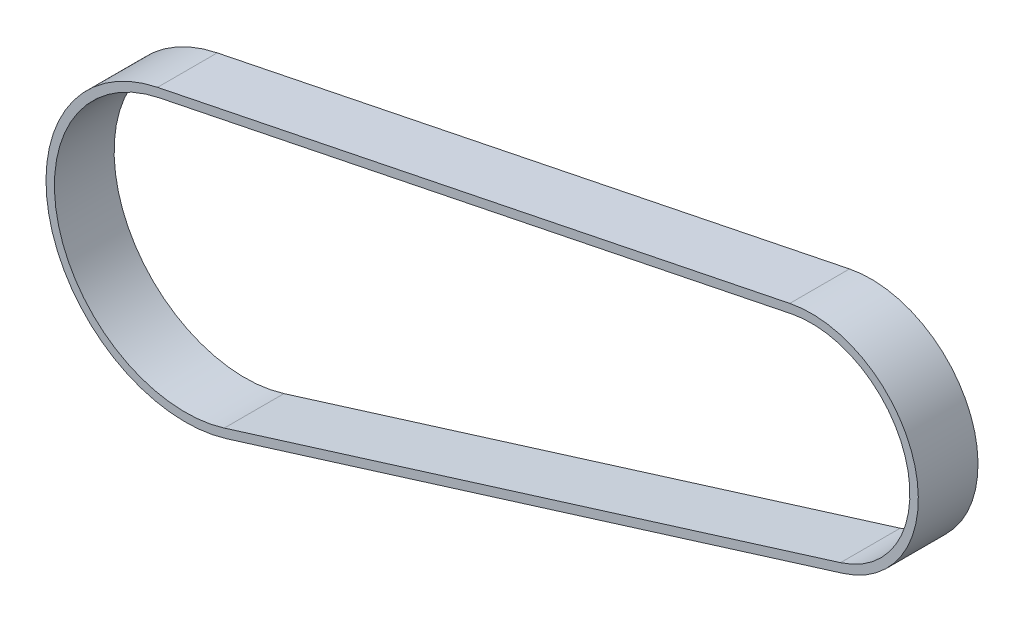
ISO-10303-21;
HEADER;
FILE_DESCRIPTION(('STEP AP214'),'2;1');
FILE_NAME('part.step','',(''),(''),'','','');
FILE_SCHEMA(('AUTOMOTIVE_DESIGN { 1 0 10303 214 1 1 1 1 }'));
ENDSEC;
DATA;
#1=APPLICATION_CONTEXT('core data for automotive mechanical design processes');
#2=APPLICATION_PROTOCOL_DEFINITION('international standard','automotive_design',2000,#1);
#3=PRODUCT_CONTEXT('',#1,'mechanical');
#4=PRODUCT('Part','Part','',(#3));
#5=PRODUCT_RELATED_PRODUCT_CATEGORY('part','',(#4));
#6=PRODUCT_DEFINITION_FORMATION('','',#4);
#7=PRODUCT_DEFINITION_CONTEXT('part definition',#1,'design');
#8=PRODUCT_DEFINITION('design','',#6,#7);
#9=PRODUCT_DEFINITION_SHAPE('','',#8);
#10=(LENGTH_UNIT() NAMED_UNIT(*) SI_UNIT(.MILLI.,.METRE.));
#11=(NAMED_UNIT(*) PLANE_ANGLE_UNIT() SI_UNIT($,.RADIAN.));
#12=(NAMED_UNIT(*) SI_UNIT($,.STERADIAN.) SOLID_ANGLE_UNIT());
#13=UNCERTAINTY_MEASURE_WITH_UNIT(LENGTH_MEASURE(1.E-05),#10,'distance_accuracy_value','');
#14=(GEOMETRIC_REPRESENTATION_CONTEXT(3) GLOBAL_UNCERTAINTY_ASSIGNED_CONTEXT((#13)) GLOBAL_UNIT_ASSIGNED_CONTEXT((#10,
#11,#12)) REPRESENTATION_CONTEXT('',''));
#15=CARTESIAN_POINT('',(0.,0.,0.));
#16=DIRECTION('',(0.,0.,1.));
#17=DIRECTION('',(1.,0.,0.));
#18=AXIS2_PLACEMENT_3D('',#15,#16,#17);
#19=CARTESIAN_POINT('',(10.4004504086688,12.8145895655307,9.));
#20=DIRECTION('',(0.,0.,-1.));
#21=DIRECTION('',(-1.,0.,0.));
#22=AXIS2_PLACEMENT_3D('',#19,#20,#21);
#23=CYLINDRICAL_SURFACE('',#22,21.02);
#24=CARTESIAN_POINT('',(10.4004504086688,12.8145895655307,0.));
#25=DIRECTION('',(0.,0.,-1.));
#26=DIRECTION('',(-1.,0.,0.));
#27=AXIS2_PLACEMENT_3D('',#24,#25,#26);
#28=CIRCLE('',#27,21.02);
#29=CARTESIAN_POINT('',(16.6397039639399,-7.25808128498236,0.));
#30=VERTEX_POINT('',#29);
#31=CARTESIAN_POINT('',(6.19801751631031,33.4102191452552,0.));
#32=VERTEX_POINT('',#31);
#33=EDGE_CURVE('E156',#30,#32,#28,.T.);
#34=ORIENTED_EDGE('',*,*,#33,.F.);
#35=DIRECTION('',(0.,0.,-1.));
#36=VECTOR('',#35,1.);
#37=CARTESIAN_POINT('',(16.6397039639399,-7.25808128498236,9.));
#38=LINE('',#37,#36);
#39=CARTESIAN_POINT('',(16.6397039639399,-7.25808128498236,9.));
#40=VERTEX_POINT('',#39);
#41=EDGE_CURVE('E12',#40,#30,#38,.T.);
#42=ORIENTED_EDGE('',*,*,#41,.F.);
#43=CARTESIAN_POINT('',(10.4004504086688,12.8145895655307,9.));
#44=DIRECTION('',(0.,0.,-1.));
#45=DIRECTION('',(-1.,0.,0.));
#46=AXIS2_PLACEMENT_3D('',#43,#44,#45);
#47=CIRCLE('',#46,21.02);
#48=CARTESIAN_POINT('',(6.19801751631031,33.4102191452552,9.));
#49=VERTEX_POINT('',#48);
#50=EDGE_CURVE('E160',#40,#49,#47,.T.);
#51=ORIENTED_EDGE('',*,*,#50,.T.);
#52=DIRECTION('',(0.,0.,-1.));
#53=VECTOR('',#52,1.);
#54=CARTESIAN_POINT('',(6.19801751631031,33.4102191452552,9.));
#55=LINE('',#54,#53);
#56=EDGE_CURVE('E61',#49,#32,#55,.T.);
#57=ORIENTED_EDGE('',*,*,#56,.T.);
#58=EDGE_LOOP('',(#34,#42,#51,#57));
#59=FACE_BOUND('',#58,.T.);
#60=ADVANCED_FACE('F58',(#59),#23,.T.);
#61=CARTESIAN_POINT('',(16.6397039639398,-7.25808128498236,9.));
#62=DIRECTION('',(0.296824622039537,-0.954932010014894,0.));
#63=DIRECTION('',(0.954932010014894,0.296824622039537,0.));
#64=AXIS2_PLACEMENT_3D('',#61,#62,#63);
#65=PLANE('',#64);
#66=DIRECTION('',(-0.954932010014894,-0.296824622039537,0.));
#67=VECTOR('',#66,1.);
#68=CARTESIAN_POINT('',(16.6397039639398,-7.25808128498236,0.));
#69=LINE('',#68,#67);
#70=CARTESIAN_POINT('',(109.542231626435,21.6191135003381,0.));
#71=VERTEX_POINT('',#70);
#72=EDGE_CURVE('E164',#71,#30,#69,.T.);
#73=ORIENTED_EDGE('',*,*,#72,.F.);
#74=DIRECTION('',(0.,0.,-1.));
#75=VECTOR('',#74,1.);
#76=CARTESIAN_POINT('',(109.542231626435,21.6191135003381,9.));
#77=LINE('',#76,#75);
#78=CARTESIAN_POINT('',(109.542231626435,21.6191135003381,9.));
#79=VERTEX_POINT('',#78);
#80=EDGE_CURVE('E66',#79,#71,#77,.T.);
#81=ORIENTED_EDGE('',*,*,#80,.F.);
#82=DIRECTION('',(-0.954932010014894,-0.296824622039537,0.));
#83=VECTOR('',#82,1.);
#84=CARTESIAN_POINT('',(16.6397039639398,-7.25808128498236,9.));
#85=LINE('',#84,#83);
#86=EDGE_CURVE('E170',#79,#40,#85,.T.);
#87=ORIENTED_EDGE('',*,*,#86,.T.);
#88=ORIENTED_EDGE('',*,*,#41,.T.);
#89=EDGE_LOOP('',(#73,#81,#87,#88));
#90=FACE_BOUND('',#89,.T.);
#91=ADVANCED_FACE('F196',(#90),#65,.T.);
#92=CARTESIAN_POINT('',(104.749256042051,37.0388781320536,9.));
#93=DIRECTION('',(0.,0.,-1.));
#94=DIRECTION('',(-1.,0.,0.));
#95=AXIS2_PLACEMENT_3D('',#92,#93,#94);
#96=CYLINDRICAL_SURFACE('',#95,16.1475);
#97=CARTESIAN_POINT('',(104.749256042051,37.0388781320536,0.));
#98=DIRECTION('',(0.,0.,-1.));
#99=DIRECTION('',(-1.,0.,0.));
#100=AXIS2_PLACEMENT_3D('',#97,#98,#99);
#101=CIRCLE('',#100,16.1475);
#102=CARTESIAN_POINT('',(101.52095988937,52.8603780672868,0.));
#103=VERTEX_POINT('',#102);
#104=EDGE_CURVE('E178',#103,#71,#101,.T.);
#105=ORIENTED_EDGE('',*,*,#104,.F.);
#106=DIRECTION('',(0.,0.,-1.));
#107=VECTOR('',#106,1.);
#108=CARTESIAN_POINT('',(101.52095988937,52.8603780672868,9.));
#109=LINE('',#108,#107);
#110=CARTESIAN_POINT('',(101.52095988937,52.8603780672868,9.));
#111=VERTEX_POINT('',#110);
#112=EDGE_CURVE('E183',#111,#103,#109,.T.);
#113=ORIENTED_EDGE('',*,*,#112,.F.);
#114=CARTESIAN_POINT('',(104.749256042051,37.0388781320536,9.));
#115=DIRECTION('',(0.,0.,-1.));
#116=DIRECTION('',(-1.,0.,0.));
#117=AXIS2_PLACEMENT_3D('',#114,#115,#116);
#118=CIRCLE('',#117,16.1475);
#119=EDGE_CURVE('E167',#111,#79,#118,.T.);
#120=ORIENTED_EDGE('',*,*,#119,.T.);
#121=ORIENTED_EDGE('',*,*,#80,.T.);
#122=EDGE_LOOP('',(#105,#113,#120,#121));
#123=FACE_BOUND('',#122,.T.);
#124=ADVANCED_FACE('F200',(#123),#96,.T.);
#125=CARTESIAN_POINT('',(6.19801751631031,33.4102191452552,9.));
#126=DIRECTION('',(-0.199925446829613,0.979811112260919,0.));
#127=DIRECTION('',(-0.979811112260919,-0.199925446829613,0.));
#128=AXIS2_PLACEMENT_3D('',#125,#126,#127);
#129=PLANE('',#128);
#130=DIRECTION('',(0.979811112260919,0.199925446829613,0.));
#131=VECTOR('',#130,1.);
#132=CARTESIAN_POINT('',(6.19801751631031,33.4102191452552,0.));
#133=LINE('',#132,#131);
#134=EDGE_CURVE('E175',#32,#103,#133,.T.);
#135=ORIENTED_EDGE('',*,*,#134,.F.);
#136=ORIENTED_EDGE('',*,*,#56,.F.);
#137=DIRECTION('',(0.979811112260919,0.199925446829613,0.));
#138=VECTOR('',#137,1.);
#139=CARTESIAN_POINT('',(6.19801751631031,33.4102191452552,9.));
#140=LINE('',#139,#138);
#141=EDGE_CURVE('E163',#49,#111,#140,.T.);
#142=ORIENTED_EDGE('',*,*,#141,.T.);
#143=ORIENTED_EDGE('',*,*,#112,.T.);
#144=EDGE_LOOP('',(#135,#136,#142,#143));
#145=FACE_BOUND('',#144,.T.);
#146=ADVANCED_FACE('F191',(#145),#129,.T.);
#147=CARTESIAN_POINT('',(10.4004504086688,12.8145895655307,9.));
#148=DIRECTION('',(0.,0.,-1.));
#149=DIRECTION('',(-1.,0.,0.));
#150=AXIS2_PLACEMENT_3D('',#147,#148,#149);
#151=PLANE('',#150);
#152=DIRECTION('',(-0.954932010014894,-0.296824622039537,0.));
#153=VECTOR('',#152,1.);
#154=CARTESIAN_POINT('',(109.165264356445,22.8318771530571,9.));
#155=LINE('',#154,#153);
#156=CARTESIAN_POINT('',(109.165264356445,22.8318771530571,9.));
#157=VERTEX_POINT('',#156);
#158=CARTESIAN_POINT('',(16.2627366939496,-6.04531763226345,9.));
#159=VERTEX_POINT('',#158);
#160=EDGE_CURVE('E131',#157,#159,#155,.T.);
#161=ORIENTED_EDGE('',*,*,#160,.T.);
#162=CARTESIAN_POINT('',(10.4004504086688,12.8145895655307,9.));
#163=DIRECTION('',(0.,0.,-1.));
#164=DIRECTION('',(-1.,0.,0.));
#165=AXIS2_PLACEMENT_3D('',#162,#163,#164);
#166=CIRCLE('',#165,19.75);
#167=CARTESIAN_POINT('',(6.45192283378391,32.1658590326839,9.));
#168=VERTEX_POINT('',#167);
#169=EDGE_CURVE('E125',#159,#168,#166,.T.);
#170=ORIENTED_EDGE('',*,*,#169,.T.);
#171=DIRECTION('',(0.979811112260919,0.199925446829613,0.));
#172=VECTOR('',#171,1.);
#173=CARTESIAN_POINT('',(6.45192283378391,32.1658590326839,9.));
#174=LINE('',#173,#172);
#175=CARTESIAN_POINT('',(101.774865206844,51.6160179547155,9.));
#176=VERTEX_POINT('',#175);
#177=EDGE_CURVE('E134',#168,#176,#174,.T.);
#178=ORIENTED_EDGE('',*,*,#177,.T.);
#179=CARTESIAN_POINT('',(104.749256042051,37.0388781320536,9.));
#180=DIRECTION('',(0.,0.,-1.));
#181=DIRECTION('',(-1.,0.,0.));
#182=AXIS2_PLACEMENT_3D('',#179,#180,#181);
#183=CIRCLE('',#182,14.8775);
#184=EDGE_CURVE('E74',#176,#157,#183,.T.);
#185=ORIENTED_EDGE('',*,*,#184,.T.);
#186=EDGE_LOOP('',(#161,#170,#178,#185));
#187=FACE_BOUND('',#186,.T.);
#188=ORIENTED_EDGE('',*,*,#50,.F.);
#189=ORIENTED_EDGE('',*,*,#86,.F.);
#190=ORIENTED_EDGE('',*,*,#119,.F.);
#191=ORIENTED_EDGE('',*,*,#141,.F.);
#192=EDGE_LOOP('',(#188,#189,#190,#191));
#193=FACE_BOUND('',#192,.T.);
#194=ADVANCED_FACE('F138',(#187,#193),#151,.F.);
#195=CARTESIAN_POINT('',(10.4004504086688,12.8145895655307,0.));
#196=DIRECTION('',(0.,0.,-1.));
#197=DIRECTION('',(-1.,0.,0.));
#198=AXIS2_PLACEMENT_3D('',#195,#196,#197);
#199=PLANE('',#198);
#200=CARTESIAN_POINT('',(10.4004504086688,12.8145895655307,0.));
#201=DIRECTION('',(0.,0.,-1.));
#202=DIRECTION('',(-1.,0.,0.));
#203=AXIS2_PLACEMENT_3D('',#200,#201,#202);
#204=CIRCLE('',#203,19.75);
#205=CARTESIAN_POINT('',(16.2627366939496,-6.04531763226345,0.));
#206=VERTEX_POINT('',#205);
#207=CARTESIAN_POINT('',(6.45192283378391,32.1658590326839,0.));
#208=VERTEX_POINT('',#207);
#209=EDGE_CURVE('E82',#206,#208,#204,.T.);
#210=ORIENTED_EDGE('',*,*,#209,.F.);
#211=DIRECTION('',(-0.954932010014894,-0.296824622039537,0.));
#212=VECTOR('',#211,1.);
#213=CARTESIAN_POINT('',(109.165264356445,22.8318771530571,0.));
#214=LINE('',#213,#212);
#215=CARTESIAN_POINT('',(109.165264356445,22.8318771530571,0.));
#216=VERTEX_POINT('',#215);
#217=EDGE_CURVE('E141',#216,#206,#214,.T.);
#218=ORIENTED_EDGE('',*,*,#217,.F.);
#219=CARTESIAN_POINT('',(104.749256042051,37.0388781320536,0.));
#220=DIRECTION('',(0.,0.,-1.));
#221=DIRECTION('',(-1.,0.,0.));
#222=AXIS2_PLACEMENT_3D('',#219,#220,#221);
#223=CIRCLE('',#222,14.8775);
#224=CARTESIAN_POINT('',(101.774865206844,51.6160179547155,0.));
#225=VERTEX_POINT('',#224);
#226=EDGE_CURVE('E144',#225,#216,#223,.T.);
#227=ORIENTED_EDGE('',*,*,#226,.F.);
#228=DIRECTION('',(0.979811112260919,0.199925446829613,0.));
#229=VECTOR('',#228,1.);
#230=CARTESIAN_POINT('',(6.45192283378391,32.1658590326839,0.));
#231=LINE('',#230,#229);
#232=EDGE_CURVE('E150',#208,#225,#231,.T.);
#233=ORIENTED_EDGE('',*,*,#232,.F.);
#234=EDGE_LOOP('',(#210,#218,#227,#233));
#235=FACE_BOUND('',#234,.T.);
#236=ORIENTED_EDGE('',*,*,#33,.T.);
#237=ORIENTED_EDGE('',*,*,#134,.T.);
#238=ORIENTED_EDGE('',*,*,#104,.T.);
#239=ORIENTED_EDGE('',*,*,#72,.T.);
#240=EDGE_LOOP('',(#236,#237,#238,#239));
#241=FACE_BOUND('',#240,.T.);
#242=ADVANCED_FACE('F193',(#235,#241),#199,.T.);
#243=CARTESIAN_POINT('',(10.4004504086688,12.8145895655307,9.));
#244=DIRECTION('',(0.,0.,-1.));
#245=DIRECTION('',(-1.,0.,0.));
#246=AXIS2_PLACEMENT_3D('',#243,#244,#245);
#247=CYLINDRICAL_SURFACE('',#246,19.75);
#248=ORIENTED_EDGE('',*,*,#209,.T.);
#249=DIRECTION('',(0.,0.,-1.));
#250=VECTOR('',#249,1.);
#251=CARTESIAN_POINT('',(6.45192283378391,32.1658590326839,9.));
#252=LINE('',#251,#250);
#253=EDGE_CURVE('E121',#168,#208,#252,.T.);
#254=ORIENTED_EDGE('',*,*,#253,.F.);
#255=ORIENTED_EDGE('',*,*,#169,.F.);
#256=DIRECTION('',(0.,0.,-1.));
#257=VECTOR('',#256,1.);
#258=CARTESIAN_POINT('',(16.2627366939496,-6.04531763226345,9.));
#259=LINE('',#258,#257);
#260=EDGE_CURVE('E154',#159,#206,#259,.T.);
#261=ORIENTED_EDGE('',*,*,#260,.T.);
#262=EDGE_LOOP('',(#248,#254,#255,#261));
#263=FACE_BOUND('',#262,.T.);
#264=ADVANCED_FACE('F123',(#263),#247,.F.);
#265=CARTESIAN_POINT('',(109.165264356445,22.8318771530571,9.));
#266=DIRECTION('',(0.296824622039537,-0.954932010014894,0.));
#267=DIRECTION('',(0.954932010014894,0.296824622039537,0.));
#268=AXIS2_PLACEMENT_3D('',#265,#266,#267);
#269=PLANE('',#268);
#270=ORIENTED_EDGE('',*,*,#217,.T.);
#271=ORIENTED_EDGE('',*,*,#260,.F.);
#272=ORIENTED_EDGE('',*,*,#160,.F.);
#273=DIRECTION('',(0.,0.,-1.));
#274=VECTOR('',#273,1.);
#275=CARTESIAN_POINT('',(109.165264356445,22.8318771530571,9.));
#276=LINE('',#275,#274);
#277=EDGE_CURVE('E157',#157,#216,#276,.T.);
#278=ORIENTED_EDGE('',*,*,#277,.T.);
#279=EDGE_LOOP('',(#270,#271,#272,#278));
#280=FACE_BOUND('',#279,.T.);
#281=ADVANCED_FACE('F251',(#280),#269,.F.);
#282=CARTESIAN_POINT('',(104.749256042051,37.0388781320536,9.));
#283=DIRECTION('',(0.,0.,-1.));
#284=DIRECTION('',(-1.,0.,0.));
#285=AXIS2_PLACEMENT_3D('',#282,#283,#284);
#286=CYLINDRICAL_SURFACE('',#285,14.8775);
#287=ORIENTED_EDGE('',*,*,#226,.T.);
#288=ORIENTED_EDGE('',*,*,#277,.F.);
#289=ORIENTED_EDGE('',*,*,#184,.F.);
#290=DIRECTION('',(0.,0.,-1.));
#291=VECTOR('',#290,1.);
#292=CARTESIAN_POINT('',(101.774865206844,51.6160179547155,9.));
#293=LINE('',#292,#291);
#294=EDGE_CURVE('E130',#176,#225,#293,.T.);
#295=ORIENTED_EDGE('',*,*,#294,.T.);
#296=EDGE_LOOP('',(#287,#288,#289,#295));
#297=FACE_BOUND('',#296,.T.);
#298=ADVANCED_FACE('F260',(#297),#286,.F.);
#299=CARTESIAN_POINT('',(6.45192283378391,32.1658590326839,9.));
#300=DIRECTION('',(-0.199925446829613,0.979811112260919,0.));
#301=DIRECTION('',(-0.979811112260919,-0.199925446829613,0.));
#302=AXIS2_PLACEMENT_3D('',#299,#300,#301);
#303=PLANE('',#302);
#304=ORIENTED_EDGE('',*,*,#232,.T.);
#305=ORIENTED_EDGE('',*,*,#294,.F.);
#306=ORIENTED_EDGE('',*,*,#177,.F.);
#307=ORIENTED_EDGE('',*,*,#253,.T.);
#308=EDGE_LOOP('',(#304,#305,#306,#307));
#309=FACE_BOUND('',#308,.T.);
#310=ADVANCED_FACE('F135',(#309),#303,.F.);
#311=CLOSED_SHELL('',(#60,#91,#124,#146,#194,#242,#264,#281,#298,#310));
#312=MANIFOLD_SOLID_BREP('B2',#311);
#313=ADVANCED_BREP_SHAPE_REPRESENTATION('',(#18,#312),#14);
#314=SHAPE_DEFINITION_REPRESENTATION(#9,#313);
ENDSEC;
END-ISO-10303-21;
